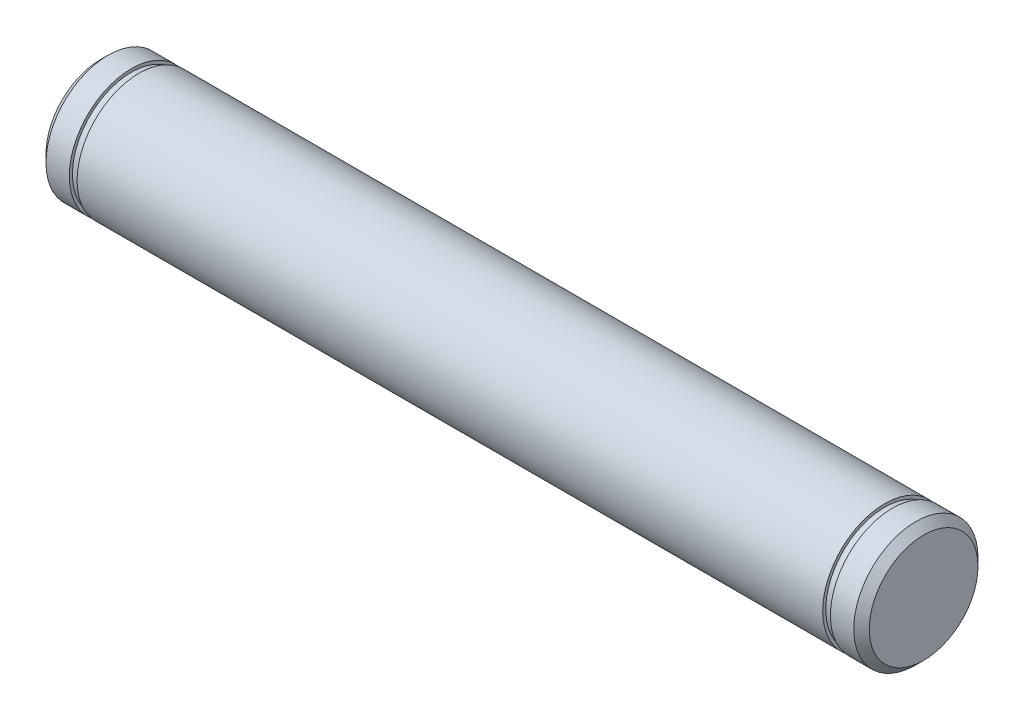
ISO-10303-21;
HEADER;
FILE_DESCRIPTION(('STEP AP214'),'2;1');
FILE_NAME('part.step','',(''),(''),'','','');
FILE_SCHEMA(('AUTOMOTIVE_DESIGN { 1 0 10303 214 1 1 1 1 }'));
ENDSEC;
DATA;
#1=APPLICATION_CONTEXT('core data for automotive mechanical design processes');
#2=APPLICATION_PROTOCOL_DEFINITION('international standard','automotive_design',2000,#1);
#3=PRODUCT_CONTEXT('',#1,'mechanical');
#4=PRODUCT('Part','Part','',(#3));
#5=PRODUCT_RELATED_PRODUCT_CATEGORY('part','',(#4));
#6=PRODUCT_DEFINITION_FORMATION('','',#4);
#7=PRODUCT_DEFINITION_CONTEXT('part definition',#1,'design');
#8=PRODUCT_DEFINITION('design','',#6,#7);
#9=PRODUCT_DEFINITION_SHAPE('','',#8);
#10=(LENGTH_UNIT() NAMED_UNIT(*) SI_UNIT(.MILLI.,.METRE.));
#11=(NAMED_UNIT(*) PLANE_ANGLE_UNIT() SI_UNIT($,.RADIAN.));
#12=(NAMED_UNIT(*) SI_UNIT($,.STERADIAN.) SOLID_ANGLE_UNIT());
#13=UNCERTAINTY_MEASURE_WITH_UNIT(LENGTH_MEASURE(1.E-05),#10,'distance_accuracy_value','');
#14=(GEOMETRIC_REPRESENTATION_CONTEXT(3) GLOBAL_UNCERTAINTY_ASSIGNED_CONTEXT((#13)) GLOBAL_UNIT_ASSIGNED_CONTEXT((#10,
#11,#12)) REPRESENTATION_CONTEXT('',''));
#15=CARTESIAN_POINT('',(0.,0.,0.));
#16=DIRECTION('',(0.,0.,1.));
#17=DIRECTION('',(1.,0.,0.));
#18=AXIS2_PLACEMENT_3D('',#15,#16,#17);
#19=CARTESIAN_POINT('',(26.5,0.,0.));
#20=DIRECTION('',(-1.,0.,0.));
#21=DIRECTION('',(0.,0.,1.));
#22=AXIS2_PLACEMENT_3D('',#19,#20,#21);
#23=CYLINDRICAL_SURFACE('',#22,2.);
#24=CARTESIAN_POINT('',(25.25,0.,0.));
#25=DIRECTION('',(1.,0.,0.));
#26=DIRECTION('',(0.,0.,-1.));
#27=AXIS2_PLACEMENT_3D('',#24,#25,#26);
#28=CIRCLE('',#27,2.);
#29=CARTESIAN_POINT('',(25.25,0.,-2.));
#30=VERTEX_POINT('',#29);
#31=EDGE_CURVE('E56',#30,#30,#28,.T.);
#32=ORIENTED_EDGE('',*,*,#31,.F.);
#33=EDGE_LOOP('',(#32));
#34=FACE_BOUND('',#33,.T.);
#35=CARTESIAN_POINT('',(1.25,0.,0.));
#36=DIRECTION('',(-1.,0.,0.));
#37=DIRECTION('',(0.,0.,1.));
#38=AXIS2_PLACEMENT_3D('',#35,#36,#37);
#39=CIRCLE('',#38,2.);
#40=CARTESIAN_POINT('',(1.25,0.,2.));
#41=VERTEX_POINT('',#40);
#42=EDGE_CURVE('E57',#41,#41,#39,.T.);
#43=ORIENTED_EDGE('',*,*,#42,.F.);
#44=EDGE_LOOP('',(#43));
#45=FACE_BOUND('',#44,.T.);
#46=ADVANCED_FACE('F36',(#34,#45),#23,.T.);
#47=CARTESIAN_POINT('',(25.25,0.,0.));
#48=DIRECTION('',(1.,0.,0.));
#49=DIRECTION('',(0.,0.,-1.));
#50=AXIS2_PLACEMENT_3D('',#47,#48,#49);
#51=PLANE('',#50);
#52=CARTESIAN_POINT('',(25.25,0.,0.));
#53=DIRECTION('',(1.,0.,0.));
#54=DIRECTION('',(0.,0.,-1.));
#55=AXIS2_PLACEMENT_3D('',#52,#53,#54);
#56=CIRCLE('',#55,1.9);
#57=CARTESIAN_POINT('',(25.25,0.,-1.9));
#58=VERTEX_POINT('',#57);
#59=EDGE_CURVE('E70',#58,#58,#56,.T.);
#60=ORIENTED_EDGE('',*,*,#59,.F.);
#61=EDGE_LOOP('',(#60));
#62=FACE_BOUND('',#61,.T.);
#63=ORIENTED_EDGE('',*,*,#31,.T.);
#64=EDGE_LOOP('',(#63));
#65=FACE_BOUND('',#64,.T.);
#66=ADVANCED_FACE('F93',(#62,#65),#51,.T.);
#67=CARTESIAN_POINT('',(25.5,0.,0.));
#68=DIRECTION('',(1.,0.,0.));
#69=DIRECTION('',(0.,0.,-1.));
#70=AXIS2_PLACEMENT_3D('',#67,#68,#69);
#71=PLANE('',#70);
#72=CARTESIAN_POINT('',(25.5,0.,0.));
#73=DIRECTION('',(1.,0.,0.));
#74=DIRECTION('',(0.,0.,-1.));
#75=AXIS2_PLACEMENT_3D('',#72,#73,#74);
#76=CIRCLE('',#75,1.9);
#77=CARTESIAN_POINT('',(25.5,0.,-1.9));
#78=VERTEX_POINT('',#77);
#79=EDGE_CURVE('E60',#78,#78,#76,.T.);
#80=ORIENTED_EDGE('',*,*,#79,.T.);
#81=EDGE_LOOP('',(#80));
#82=FACE_BOUND('',#81,.T.);
#83=CARTESIAN_POINT('',(25.5,0.,0.));
#84=DIRECTION('',(1.,0.,0.));
#85=DIRECTION('',(0.,0.,-1.));
#86=AXIS2_PLACEMENT_3D('',#83,#84,#85);
#87=CIRCLE('',#86,2.);
#88=CARTESIAN_POINT('',(25.5,0.,-2.));
#89=VERTEX_POINT('',#88);
#90=EDGE_CURVE('E67',#89,#89,#87,.T.);
#91=ORIENTED_EDGE('',*,*,#90,.F.);
#92=EDGE_LOOP('',(#91));
#93=FACE_BOUND('',#92,.T.);
#94=ADVANCED_FACE('F100',(#82,#93),#71,.F.);
#95=CARTESIAN_POINT('',(25.25,0.,0.));
#96=DIRECTION('',(1.,0.,0.));
#97=DIRECTION('',(0.,0.,-1.));
#98=AXIS2_PLACEMENT_3D('',#95,#96,#97);
#99=CYLINDRICAL_SURFACE('',#98,1.9);
#100=ORIENTED_EDGE('',*,*,#59,.T.);
#101=EDGE_LOOP('',(#100));
#102=FACE_BOUND('',#101,.T.);
#103=ORIENTED_EDGE('',*,*,#79,.F.);
#104=EDGE_LOOP('',(#103));
#105=FACE_BOUND('',#104,.T.);
#106=ADVANCED_FACE('F114',(#102,#105),#99,.T.);
#107=CARTESIAN_POINT('',(26.5,0.,0.));
#108=DIRECTION('',(1.,0.,0.));
#109=DIRECTION('',(0.,0.,-1.));
#110=AXIS2_PLACEMENT_3D('',#107,#108,#109);
#111=PLANE('',#110);
#112=CARTESIAN_POINT('',(26.5,0.,0.));
#113=DIRECTION('',(1.,0.,0.));
#114=DIRECTION('',(0.,0.,-1.));
#115=AXIS2_PLACEMENT_3D('',#112,#113,#114);
#116=CIRCLE('',#115,1.75);
#117=CARTESIAN_POINT('',(26.5,0.,-1.75));
#118=VERTEX_POINT('',#117);
#119=EDGE_CURVE('E43',#118,#118,#116,.T.);
#120=ORIENTED_EDGE('',*,*,#119,.T.);
#121=EDGE_LOOP('',(#120));
#122=FACE_BOUND('',#121,.T.);
#123=ADVANCED_FACE('F110',(#122),#111,.T.);
#124=CARTESIAN_POINT('',(26.25,0.,0.));
#125=DIRECTION('',(1.,0.,0.));
#126=DIRECTION('',(0.,0.,-1.));
#127=AXIS2_PLACEMENT_3D('',#124,#125,#126);
#128=CIRCLE('',#127,2.);
#129=CARTESIAN_POINT('',(26.25,0.,-2.));
#130=VERTEX_POINT('',#129);
#131=EDGE_CURVE('E10',#130,#130,#128,.F.);
#132=ORIENTED_EDGE('',*,*,#131,.T.);
#133=EDGE_LOOP('',(#132));
#134=FACE_BOUND('',#133,.T.);
#135=ORIENTED_EDGE('',*,*,#90,.T.);
#136=EDGE_LOOP('',(#135));
#137=FACE_BOUND('',#136,.T.);
#138=ADVANCED_FACE('F88',(#134,#137),#23,.T.);
#139=CARTESIAN_POINT('',(1.25,0.,0.));
#140=DIRECTION('',(-1.,0.,0.));
#141=DIRECTION('',(0.,0.,1.));
#142=AXIS2_PLACEMENT_3D('',#139,#140,#141);
#143=PLANE('',#142);
#144=CARTESIAN_POINT('',(1.25,0.,0.));
#145=DIRECTION('',(-1.,0.,0.));
#146=DIRECTION('',(0.,0.,1.));
#147=AXIS2_PLACEMENT_3D('',#144,#145,#146);
#148=CIRCLE('',#147,1.9);
#149=CARTESIAN_POINT('',(1.25,0.,1.9));
#150=VERTEX_POINT('',#149);
#151=EDGE_CURVE('E64',#150,#150,#148,.T.);
#152=ORIENTED_EDGE('',*,*,#151,.F.);
#153=EDGE_LOOP('',(#152));
#154=FACE_BOUND('',#153,.T.);
#155=ORIENTED_EDGE('',*,*,#42,.T.);
#156=EDGE_LOOP('',(#155));
#157=FACE_BOUND('',#156,.T.);
#158=ADVANCED_FACE('F84',(#154,#157),#143,.T.);
#159=CARTESIAN_POINT('',(1.,0.,0.));
#160=DIRECTION('',(-1.,0.,0.));
#161=DIRECTION('',(0.,0.,1.));
#162=AXIS2_PLACEMENT_3D('',#159,#160,#161);
#163=PLANE('',#162);
#164=CARTESIAN_POINT('',(1.,0.,0.));
#165=DIRECTION('',(-1.,0.,0.));
#166=DIRECTION('',(0.,0.,1.));
#167=AXIS2_PLACEMENT_3D('',#164,#165,#166);
#168=CIRCLE('',#167,1.9);
#169=CARTESIAN_POINT('',(1.,0.,1.9));
#170=VERTEX_POINT('',#169);
#171=EDGE_CURVE('E75',#170,#170,#168,.T.);
#172=ORIENTED_EDGE('',*,*,#171,.T.);
#173=EDGE_LOOP('',(#172));
#174=FACE_BOUND('',#173,.T.);
#175=CARTESIAN_POINT('',(1.,0.,0.));
#176=DIRECTION('',(-1.,0.,0.));
#177=DIRECTION('',(0.,0.,1.));
#178=AXIS2_PLACEMENT_3D('',#175,#176,#177);
#179=CIRCLE('',#178,2.);
#180=CARTESIAN_POINT('',(1.,0.,2.));
#181=VERTEX_POINT('',#180);
#182=EDGE_CURVE('E61',#181,#181,#179,.T.);
#183=ORIENTED_EDGE('',*,*,#182,.F.);
#184=EDGE_LOOP('',(#183));
#185=FACE_BOUND('',#184,.T.);
#186=ADVANCED_FACE('F87',(#174,#185),#163,.F.);
#187=CARTESIAN_POINT('',(1.25,0.,0.));
#188=DIRECTION('',(-1.,0.,0.));
#189=DIRECTION('',(0.,0.,1.));
#190=AXIS2_PLACEMENT_3D('',#187,#188,#189);
#191=CYLINDRICAL_SURFACE('',#190,1.9);
#192=ORIENTED_EDGE('',*,*,#151,.T.);
#193=EDGE_LOOP('',(#192));
#194=FACE_BOUND('',#193,.T.);
#195=ORIENTED_EDGE('',*,*,#171,.F.);
#196=EDGE_LOOP('',(#195));
#197=FACE_BOUND('',#196,.T.);
#198=ADVANCED_FACE('F81',(#194,#197),#191,.T.);
#199=CARTESIAN_POINT('',(0.,0.,0.));
#200=DIRECTION('',(1.,0.,0.));
#201=DIRECTION('',(0.,0.,-1.));
#202=AXIS2_PLACEMENT_3D('',#199,#200,#201);
#203=PLANE('',#202);
#204=CARTESIAN_POINT('',(0.,0.,0.));
#205=DIRECTION('',(1.,0.,0.));
#206=DIRECTION('',(0.,0.,-1.));
#207=AXIS2_PLACEMENT_3D('',#204,#205,#206);
#208=CIRCLE('',#207,1.75);
#209=CARTESIAN_POINT('',(0.,0.,-1.75));
#210=VERTEX_POINT('',#209);
#211=EDGE_CURVE('E47',#210,#210,#208,.F.);
#212=ORIENTED_EDGE('',*,*,#211,.T.);
#213=EDGE_LOOP('',(#212));
#214=FACE_BOUND('',#213,.T.);
#215=ADVANCED_FACE('F107',(#214),#203,.F.);
#216=CARTESIAN_POINT('',(0.249999999999997,0.,0.));
#217=DIRECTION('',(1.,0.,0.));
#218=DIRECTION('',(0.,0.,-1.));
#219=AXIS2_PLACEMENT_3D('',#216,#217,#218);
#220=CIRCLE('',#219,2.);
#221=CARTESIAN_POINT('',(0.249999999999997,0.,-2.));
#222=VERTEX_POINT('',#221);
#223=EDGE_CURVE('E51',#222,#222,#220,.T.);
#224=ORIENTED_EDGE('',*,*,#223,.T.);
#225=EDGE_LOOP('',(#224));
#226=FACE_BOUND('',#225,.T.);
#227=ORIENTED_EDGE('',*,*,#182,.T.);
#228=EDGE_LOOP('',(#227));
#229=FACE_BOUND('',#228,.T.);
#230=ADVANCED_FACE('F96',(#226,#229),#23,.T.);
#231=CARTESIAN_POINT('',(0.249999999999997,0.,0.));
#232=DIRECTION('',(1.,0.,0.));
#233=DIRECTION('',(0.,0.,-1.));
#234=AXIS2_PLACEMENT_3D('',#231,#232,#233);
#235=CONICAL_SURFACE('',#234,2.,0.785398163397452);
#236=ORIENTED_EDGE('',*,*,#211,.F.);
#237=EDGE_LOOP('',(#236));
#238=FACE_BOUND('',#237,.T.);
#239=ORIENTED_EDGE('',*,*,#223,.F.);
#240=EDGE_LOOP('',(#239));
#241=FACE_BOUND('',#240,.T.);
#242=ADVANCED_FACE('F106',(#238,#241),#235,.T.);
#243=CARTESIAN_POINT('',(26.5,0.,0.));
#244=DIRECTION('',(-1.,0.,0.));
#245=DIRECTION('',(0.,0.,1.));
#246=AXIS2_PLACEMENT_3D('',#243,#244,#245);
#247=CONICAL_SURFACE('',#246,1.75,0.785398163397452);
#248=ORIENTED_EDGE('',*,*,#131,.F.);
#249=EDGE_LOOP('',(#248));
#250=FACE_BOUND('',#249,.T.);
#251=ORIENTED_EDGE('',*,*,#119,.F.);
#252=EDGE_LOOP('',(#251));
#253=FACE_BOUND('',#252,.T.);
#254=ADVANCED_FACE('F38',(#250,#253),#247,.T.);
#255=CLOSED_SHELL('',(#46,#66,#94,#106,#123,#138,#158,#186,#198,#215,#230,#242,#254));
#256=MANIFOLD_SOLID_BREP('B2',#255);
#257=ADVANCED_BREP_SHAPE_REPRESENTATION('',(#18,#256),#14);
#258=SHAPE_DEFINITION_REPRESENTATION(#9,#257);
ENDSEC;
END-ISO-10303-21;
